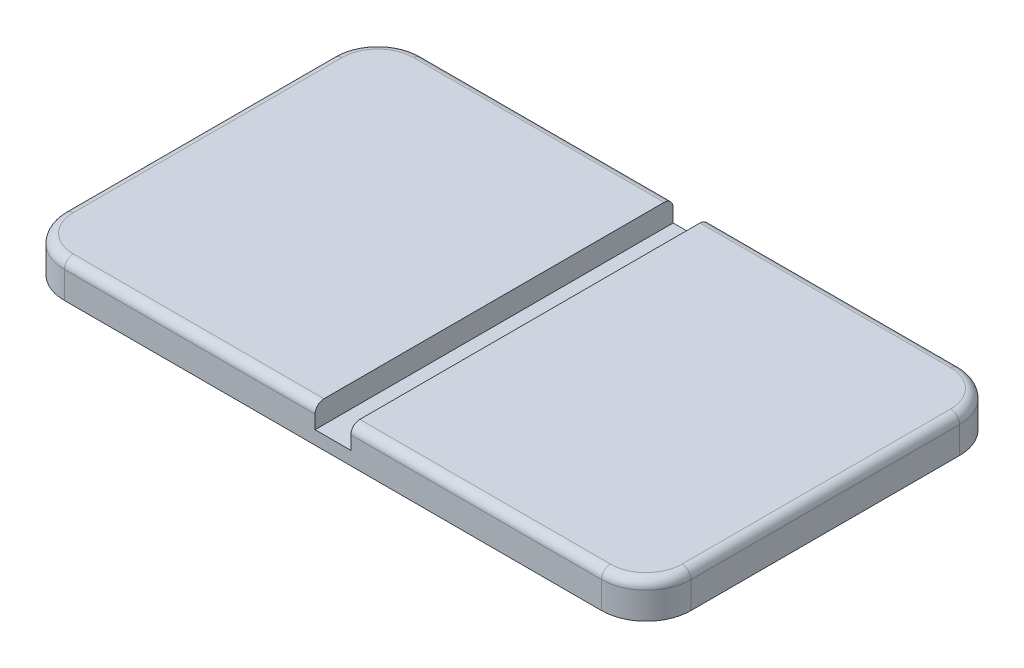
ISO-10303-21;
HEADER;
FILE_DESCRIPTION(('STEP AP214'),'2;1');
FILE_NAME('part.step','',(''),(''),'','','');
FILE_SCHEMA(('AUTOMOTIVE_DESIGN { 1 0 10303 214 1 1 1 1 }'));
ENDSEC;
DATA;
#1=APPLICATION_CONTEXT('core data for automotive mechanical design processes');
#2=APPLICATION_PROTOCOL_DEFINITION('international standard','automotive_design',2000,#1);
#3=PRODUCT_CONTEXT('',#1,'mechanical');
#4=PRODUCT('Part','Part','',(#3));
#5=PRODUCT_RELATED_PRODUCT_CATEGORY('part','',(#4));
#6=PRODUCT_DEFINITION_FORMATION('','',#4);
#7=PRODUCT_DEFINITION_CONTEXT('part definition',#1,'design');
#8=PRODUCT_DEFINITION('design','',#6,#7);
#9=PRODUCT_DEFINITION_SHAPE('','',#8);
#10=(LENGTH_UNIT() NAMED_UNIT(*) SI_UNIT(.MILLI.,.METRE.));
#11=(NAMED_UNIT(*) PLANE_ANGLE_UNIT() SI_UNIT($,.RADIAN.));
#12=(NAMED_UNIT(*) SI_UNIT($,.STERADIAN.) SOLID_ANGLE_UNIT());
#13=UNCERTAINTY_MEASURE_WITH_UNIT(LENGTH_MEASURE(1.E-05),#10,'distance_accuracy_value','');
#14=(GEOMETRIC_REPRESENTATION_CONTEXT(3) GLOBAL_UNCERTAINTY_ASSIGNED_CONTEXT((#13)) GLOBAL_UNIT_ASSIGNED_CONTEXT((#10,
#11,#12)) REPRESENTATION_CONTEXT('',''));
#15=CARTESIAN_POINT('',(0.,0.,0.));
#16=DIRECTION('',(0.,0.,1.));
#17=DIRECTION('',(1.,0.,0.));
#18=AXIS2_PLACEMENT_3D('',#15,#16,#17);
#19=CARTESIAN_POINT('',(0.,3.,-40.));
#20=DIRECTION('',(0.,0.,-1.));
#21=DIRECTION('',(-1.,0.,0.));
#22=AXIS2_PLACEMENT_3D('',#19,#20,#21);
#23=PLANE('',#22);
#24=DIRECTION('',(0.,-1.,0.));
#25=VECTOR('',#24,1.);
#26=CARTESIAN_POINT('',(3.99999999999999,8.,-40.));
#27=LINE('',#26,#25);
#28=CARTESIAN_POINT('',(3.99999999999999,6.,-40.));
#29=VERTEX_POINT('',#28);
#30=CARTESIAN_POINT('',(3.99999999999999,3.,-40.));
#31=VERTEX_POINT('',#30);
#32=EDGE_CURVE('E217',#29,#31,#27,.T.);
#33=ORIENTED_EDGE('',*,*,#32,.F.);
#34=DIRECTION('',(1.,0.,0.));
#35=VECTOR('',#34,1.);
#36=CARTESIAN_POINT('',(0.,6.,-40.));
#37=LINE('',#36,#35);
#38=CARTESIAN_POINT('',(60.,6.,-40.));
#39=VERTEX_POINT('',#38);
#40=EDGE_CURVE('E314',#29,#39,#37,.T.);
#41=ORIENTED_EDGE('',*,*,#40,.T.);
#42=DIRECTION('',(0.,-1.,0.));
#43=VECTOR('',#42,1.);
#44=CARTESIAN_POINT('',(60.,8.,-40.));
#45=LINE('',#44,#43);
#46=CARTESIAN_POINT('',(60.,0.,-40.));
#47=VERTEX_POINT('',#46);
#48=EDGE_CURVE('E220',#39,#47,#45,.T.);
#49=ORIENTED_EDGE('',*,*,#48,.T.);
#50=DIRECTION('',(1.,0.,0.));
#51=VECTOR('',#50,1.);
#52=CARTESIAN_POINT('',(0.,0.,-40.));
#53=LINE('',#52,#51);
#54=CARTESIAN_POINT('',(-60.,0.,-40.));
#55=VERTEX_POINT('',#54);
#56=EDGE_CURVE('E258',#55,#47,#53,.T.);
#57=ORIENTED_EDGE('',*,*,#56,.F.);
#58=DIRECTION('',(0.,-1.,0.));
#59=VECTOR('',#58,1.);
#60=CARTESIAN_POINT('',(-60.,8.,-40.));
#61=LINE('',#60,#59);
#62=CARTESIAN_POINT('',(-60.,6.,-40.));
#63=VERTEX_POINT('',#62);
#64=EDGE_CURVE('E255',#63,#55,#61,.T.);
#65=ORIENTED_EDGE('',*,*,#64,.F.);
#66=DIRECTION('',(1.,0.,0.));
#67=VECTOR('',#66,1.);
#68=CARTESIAN_POINT('',(0.,6.,-40.));
#69=LINE('',#68,#67);
#70=CARTESIAN_POINT('',(-4.00000000000001,6.,-40.));
#71=VERTEX_POINT('',#70);
#72=EDGE_CURVE('E311',#63,#71,#69,.T.);
#73=ORIENTED_EDGE('',*,*,#72,.T.);
#74=DIRECTION('',(0.,-1.,0.));
#75=VECTOR('',#74,1.);
#76=CARTESIAN_POINT('',(-4.00000000000001,8.,-40.));
#77=LINE('',#76,#75);
#78=CARTESIAN_POINT('',(-4.00000000000001,3.,-40.));
#79=VERTEX_POINT('',#78);
#80=EDGE_CURVE('E229',#71,#79,#77,.T.);
#81=ORIENTED_EDGE('',*,*,#80,.T.);
#82=DIRECTION('',(1.,0.,0.));
#83=VECTOR('',#82,1.);
#84=CARTESIAN_POINT('',(0.,3.,-40.));
#85=LINE('',#84,#83);
#86=EDGE_CURVE('E259',#79,#31,#85,.T.);
#87=ORIENTED_EDGE('',*,*,#86,.T.);
#88=EDGE_LOOP('',(#33,#41,#49,#57,#65,#73,#81,#87));
#89=FACE_BOUND('',#88,.T.);
#90=ADVANCED_FACE('F45',(#89),#23,.T.);
#91=CARTESIAN_POINT('',(0.,3.,40.));
#92=DIRECTION('',(0.,0.,-1.));
#93=DIRECTION('',(-1.,0.,0.));
#94=AXIS2_PLACEMENT_3D('',#91,#92,#93);
#95=PLANE('',#94);
#96=DIRECTION('',(0.,-1.,0.));
#97=VECTOR('',#96,1.);
#98=CARTESIAN_POINT('',(60.,8.,40.));
#99=LINE('',#98,#97);
#100=CARTESIAN_POINT('',(60.,6.,40.));
#101=VERTEX_POINT('',#100);
#102=CARTESIAN_POINT('',(60.,0.,40.));
#103=VERTEX_POINT('',#102);
#104=EDGE_CURVE('E198',#101,#103,#99,.T.);
#105=ORIENTED_EDGE('',*,*,#104,.F.);
#106=DIRECTION('',(1.,0.,0.));
#107=VECTOR('',#106,1.);
#108=CARTESIAN_POINT('',(3.99999999999999,6.,40.));
#109=LINE('',#108,#107);
#110=CARTESIAN_POINT('',(3.99999999999999,6.,40.));
#111=VERTEX_POINT('',#110);
#112=EDGE_CURVE('E299',#101,#111,#109,.F.);
#113=ORIENTED_EDGE('',*,*,#112,.T.);
#114=DIRECTION('',(0.,-1.,0.));
#115=VECTOR('',#114,1.);
#116=CARTESIAN_POINT('',(3.99999999999999,8.,40.));
#117=LINE('',#116,#115);
#118=CARTESIAN_POINT('',(3.99999999999999,3.,40.));
#119=VERTEX_POINT('',#118);
#120=EDGE_CURVE('E214',#111,#119,#117,.T.);
#121=ORIENTED_EDGE('',*,*,#120,.T.);
#122=DIRECTION('',(1.,0.,0.));
#123=VECTOR('',#122,1.);
#124=CARTESIAN_POINT('',(0.,3.,40.));
#125=LINE('',#124,#123);
#126=CARTESIAN_POINT('',(-4.00000000000001,3.,40.));
#127=VERTEX_POINT('',#126);
#128=EDGE_CURVE('E268',#127,#119,#125,.T.);
#129=ORIENTED_EDGE('',*,*,#128,.F.);
#130=DIRECTION('',(0.,-1.,0.));
#131=VECTOR('',#130,1.);
#132=CARTESIAN_POINT('',(-4.00000000000001,8.,40.));
#133=LINE('',#132,#131);
#134=CARTESIAN_POINT('',(-4.00000000000001,6.,40.));
#135=VERTEX_POINT('',#134);
#136=EDGE_CURVE('E243',#135,#127,#133,.T.);
#137=ORIENTED_EDGE('',*,*,#136,.F.);
#138=DIRECTION('',(1.,0.,0.));
#139=VECTOR('',#138,1.);
#140=CARTESIAN_POINT('',(-60.,6.,40.));
#141=LINE('',#140,#139);
#142=CARTESIAN_POINT('',(-60.,6.,40.));
#143=VERTEX_POINT('',#142);
#144=EDGE_CURVE('E296',#135,#143,#141,.F.);
#145=ORIENTED_EDGE('',*,*,#144,.T.);
#146=DIRECTION('',(0.,-1.,0.));
#147=VECTOR('',#146,1.);
#148=CARTESIAN_POINT('',(-60.,8.,40.));
#149=LINE('',#148,#147);
#150=CARTESIAN_POINT('',(-60.,0.,40.));
#151=VERTEX_POINT('',#150);
#152=EDGE_CURVE('E246',#143,#151,#149,.T.);
#153=ORIENTED_EDGE('',*,*,#152,.T.);
#154=DIRECTION('',(1.,0.,0.));
#155=VECTOR('',#154,1.);
#156=CARTESIAN_POINT('',(0.,0.,40.));
#157=LINE('',#156,#155);
#158=EDGE_CURVE('E264',#151,#103,#157,.T.);
#159=ORIENTED_EDGE('',*,*,#158,.T.);
#160=EDGE_LOOP('',(#105,#113,#121,#129,#137,#145,#153,#159));
#161=FACE_BOUND('',#160,.T.);
#162=ADVANCED_FACE('F431',(#161),#95,.F.);
#163=CARTESIAN_POINT('',(0.,3.,0.));
#164=DIRECTION('',(0.,1.,0.));
#165=DIRECTION('',(0.,0.,1.));
#166=AXIS2_PLACEMENT_3D('',#163,#164,#165);
#167=PLANE('',#166);
#168=ORIENTED_EDGE('',*,*,#86,.F.);
#169=DIRECTION('',(0.,0.,1.));
#170=VECTOR('',#169,1.);
#171=CARTESIAN_POINT('',(-4.00000000000001,3.,0.));
#172=LINE('',#171,#170);
#173=EDGE_CURVE('E263',#79,#127,#172,.T.);
#174=ORIENTED_EDGE('',*,*,#173,.T.);
#175=ORIENTED_EDGE('',*,*,#128,.T.);
#176=DIRECTION('',(0.,0.,1.));
#177=VECTOR('',#176,1.);
#178=CARTESIAN_POINT('',(3.99999999999999,3.,0.));
#179=LINE('',#178,#177);
#180=EDGE_CURVE('E272',#31,#119,#179,.T.);
#181=ORIENTED_EDGE('',*,*,#180,.F.);
#182=EDGE_LOOP('',(#168,#174,#175,#181));
#183=FACE_BOUND('',#182,.T.);
#184=ADVANCED_FACE('F397',(#183),#167,.T.);
#185=CARTESIAN_POINT('',(0.,0.,0.));
#186=DIRECTION('',(0.,1.,0.));
#187=DIRECTION('',(0.,0.,1.));
#188=AXIS2_PLACEMENT_3D('',#185,#186,#187);
#189=PLANE('',#188);
#190=ORIENTED_EDGE('',*,*,#56,.T.);
#191=CARTESIAN_POINT('',(60.,0.,-30.));
#192=DIRECTION('',(0.,1.,0.));
#193=DIRECTION('',(0.,0.,1.));
#194=AXIS2_PLACEMENT_3D('',#191,#192,#193);
#195=CIRCLE('',#194,10.);
#196=CARTESIAN_POINT('',(70.,0.,-30.));
#197=VERTEX_POINT('',#196);
#198=EDGE_CURVE('E193',#47,#197,#195,.F.);
#199=ORIENTED_EDGE('',*,*,#198,.T.);
#200=DIRECTION('',(0.,0.,-1.));
#201=VECTOR('',#200,1.);
#202=CARTESIAN_POINT('',(70.,0.,0.));
#203=LINE('',#202,#201);
#204=CARTESIAN_POINT('',(70.,0.,30.));
#205=VERTEX_POINT('',#204);
#206=EDGE_CURVE('E176',#205,#197,#203,.T.);
#207=ORIENTED_EDGE('',*,*,#206,.F.);
#208=CARTESIAN_POINT('',(60.,0.,30.));
#209=DIRECTION('',(0.,1.,0.));
#210=DIRECTION('',(0.,0.,1.));
#211=AXIS2_PLACEMENT_3D('',#208,#209,#210);
#212=CIRCLE('',#211,10.);
#213=EDGE_CURVE('E191',#205,#103,#212,.F.);
#214=ORIENTED_EDGE('',*,*,#213,.T.);
#215=ORIENTED_EDGE('',*,*,#158,.F.);
#216=CARTESIAN_POINT('',(-60.,0.,30.));
#217=DIRECTION('',(0.,1.,0.));
#218=DIRECTION('',(0.,0.,1.));
#219=AXIS2_PLACEMENT_3D('',#216,#217,#218);
#220=CIRCLE('',#219,10.);
#221=CARTESIAN_POINT('',(-70.,0.,30.));
#222=VERTEX_POINT('',#221);
#223=EDGE_CURVE('E230',#222,#151,#220,.T.);
#224=ORIENTED_EDGE('',*,*,#223,.F.);
#225=DIRECTION('',(0.,0.,-1.));
#226=VECTOR('',#225,1.);
#227=CARTESIAN_POINT('',(-70.,0.,0.));
#228=LINE('',#227,#226);
#229=CARTESIAN_POINT('',(-70.,0.,-30.));
#230=VERTEX_POINT('',#229);
#231=EDGE_CURVE('E234',#222,#230,#228,.T.);
#232=ORIENTED_EDGE('',*,*,#231,.T.);
#233=CARTESIAN_POINT('',(-60.,0.,-30.));
#234=DIRECTION('',(0.,1.,0.));
#235=DIRECTION('',(0.,0.,1.));
#236=AXIS2_PLACEMENT_3D('',#233,#234,#235);
#237=CIRCLE('',#236,10.);
#238=EDGE_CURVE('E183',#55,#230,#237,.T.);
#239=ORIENTED_EDGE('',*,*,#238,.F.);
#240=EDGE_LOOP('',(#190,#199,#207,#214,#215,#224,#232,#239));
#241=FACE_BOUND('',#240,.T.);
#242=ADVANCED_FACE('F189',(#241),#189,.F.);
#243=CARTESIAN_POINT('',(-4.00000000000001,8.,0.));
#244=DIRECTION('',(1.,0.,0.));
#245=DIRECTION('',(0.,0.,-1.));
#246=AXIS2_PLACEMENT_3D('',#243,#244,#245);
#247=PLANE('',#246);
#248=DIRECTION('',(0.,0.,1.));
#249=VECTOR('',#248,1.);
#250=CARTESIAN_POINT('',(-4.00000000000001,8.,0.));
#251=LINE('',#250,#249);
#252=CARTESIAN_POINT('',(-4.00000000000001,8.,-38.));
#253=VERTEX_POINT('',#252);
#254=CARTESIAN_POINT('',(-4.00000000000001,8.,38.));
#255=VERTEX_POINT('',#254);
#256=EDGE_CURVE('E225',#253,#255,#251,.T.);
#257=ORIENTED_EDGE('',*,*,#256,.T.);
#258=CARTESIAN_POINT('',(-4.00000000000001,6.,38.));
#259=DIRECTION('',(1.,0.,0.));
#260=DIRECTION('',(0.,0.,-1.));
#261=AXIS2_PLACEMENT_3D('',#258,#259,#260);
#262=CIRCLE('',#261,2.);
#263=EDGE_CURVE('E339',#255,#135,#262,.T.);
#264=ORIENTED_EDGE('',*,*,#263,.T.);
#265=ORIENTED_EDGE('',*,*,#136,.T.);
#266=ORIENTED_EDGE('',*,*,#173,.F.);
#267=ORIENTED_EDGE('',*,*,#80,.F.);
#268=CARTESIAN_POINT('',(-4.00000000000001,6.,-38.));
#269=DIRECTION('',(1.,0.,0.));
#270=DIRECTION('',(0.,0.,-1.));
#271=AXIS2_PLACEMENT_3D('',#268,#269,#270);
#272=CIRCLE('',#271,2.);
#273=EDGE_CURVE('E336',#71,#253,#272,.T.);
#274=ORIENTED_EDGE('',*,*,#273,.T.);
#275=EDGE_LOOP('',(#257,#264,#265,#266,#267,#274));
#276=FACE_BOUND('',#275,.T.);
#277=ADVANCED_FACE('F390',(#276),#247,.T.);
#278=CARTESIAN_POINT('',(-60.,8.,-30.));
#279=DIRECTION('',(0.,-1.,0.));
#280=DIRECTION('',(0.,0.,-1.));
#281=AXIS2_PLACEMENT_3D('',#278,#279,#280);
#282=CYLINDRICAL_SURFACE('',#281,10.);
#283=DIRECTION('',(0.,-1.,0.));
#284=VECTOR('',#283,1.);
#285=CARTESIAN_POINT('',(-70.,8.,-30.));
#286=LINE('',#285,#284);
#287=CARTESIAN_POINT('',(-70.,6.,-30.));
#288=VERTEX_POINT('',#287);
#289=EDGE_CURVE('E252',#288,#230,#286,.T.);
#290=ORIENTED_EDGE('',*,*,#289,.F.);
#291=CARTESIAN_POINT('',(-60.,6.,-30.));
#292=DIRECTION('',(0.,1.,0.));
#293=DIRECTION('',(0.,0.,1.));
#294=AXIS2_PLACEMENT_3D('',#291,#292,#293);
#295=CIRCLE('',#294,10.);
#296=EDGE_CURVE('E344',#288,#63,#295,.F.);
#297=ORIENTED_EDGE('',*,*,#296,.T.);
#298=ORIENTED_EDGE('',*,*,#64,.T.);
#299=ORIENTED_EDGE('',*,*,#238,.T.);
#300=EDGE_LOOP('',(#290,#297,#298,#299));
#301=FACE_BOUND('',#300,.T.);
#302=ADVANCED_FACE('F417',(#301),#282,.T.);
#303=CARTESIAN_POINT('',(-70.,8.,0.));
#304=DIRECTION('',(-1.,0.,0.));
#305=DIRECTION('',(0.,0.,1.));
#306=AXIS2_PLACEMENT_3D('',#303,#304,#305);
#307=PLANE('',#306);
#308=DIRECTION('',(0.,-1.,0.));
#309=VECTOR('',#308,1.);
#310=CARTESIAN_POINT('',(-70.,8.,30.));
#311=LINE('',#310,#309);
#312=CARTESIAN_POINT('',(-70.,6.,30.));
#313=VERTEX_POINT('',#312);
#314=EDGE_CURVE('E249',#313,#222,#311,.T.);
#315=ORIENTED_EDGE('',*,*,#314,.F.);
#316=DIRECTION('',(0.,0.,-1.));
#317=VECTOR('',#316,1.);
#318=CARTESIAN_POINT('',(-70.,6.,0.));
#319=LINE('',#318,#317);
#320=EDGE_CURVE('E11',#313,#288,#319,.T.);
#321=ORIENTED_EDGE('',*,*,#320,.T.);
#322=ORIENTED_EDGE('',*,*,#289,.T.);
#323=ORIENTED_EDGE('',*,*,#231,.F.);
#324=EDGE_LOOP('',(#315,#321,#322,#323));
#325=FACE_BOUND('',#324,.T.);
#326=ADVANCED_FACE('F418',(#325),#307,.T.);
#327=CARTESIAN_POINT('',(-60.,8.,30.));
#328=DIRECTION('',(0.,-1.,0.));
#329=DIRECTION('',(0.,0.,-1.));
#330=AXIS2_PLACEMENT_3D('',#327,#328,#329);
#331=CYLINDRICAL_SURFACE('',#330,10.);
#332=ORIENTED_EDGE('',*,*,#152,.F.);
#333=CARTESIAN_POINT('',(-60.,6.,30.));
#334=DIRECTION('',(0.,1.,0.));
#335=DIRECTION('',(0.,0.,1.));
#336=AXIS2_PLACEMENT_3D('',#333,#334,#335);
#337=CIRCLE('',#336,10.);
#338=EDGE_CURVE('E69',#143,#313,#337,.F.);
#339=ORIENTED_EDGE('',*,*,#338,.T.);
#340=ORIENTED_EDGE('',*,*,#314,.T.);
#341=ORIENTED_EDGE('',*,*,#223,.T.);
#342=EDGE_LOOP('',(#332,#339,#340,#341));
#343=FACE_BOUND('',#342,.T.);
#344=ADVANCED_FACE('F484',(#343),#331,.T.);
#345=CARTESIAN_POINT('',(0.,8.,0.));
#346=DIRECTION('',(0.,1.,0.));
#347=DIRECTION('',(0.,0.,1.));
#348=AXIS2_PLACEMENT_3D('',#345,#346,#347);
#349=PLANE('',#348);
#350=CARTESIAN_POINT('',(-60.,8.,30.));
#351=DIRECTION('',(0.,1.,0.));
#352=DIRECTION('',(0.,0.,1.));
#353=AXIS2_PLACEMENT_3D('',#350,#351,#352);
#354=CIRCLE('',#353,8.00000000000001);
#355=CARTESIAN_POINT('',(-68.,8.,30.));
#356=VERTEX_POINT('',#355);
#357=CARTESIAN_POINT('',(-60.,8.,38.));
#358=VERTEX_POINT('',#357);
#359=EDGE_CURVE('E329',#356,#358,#354,.T.);
#360=ORIENTED_EDGE('',*,*,#359,.T.);
#361=DIRECTION('',(1.,0.,0.));
#362=VECTOR('',#361,1.);
#363=CARTESIAN_POINT('',(-4.00000000000001,8.,38.));
#364=LINE('',#363,#362);
#365=EDGE_CURVE('E332',#358,#255,#364,.T.);
#366=ORIENTED_EDGE('',*,*,#365,.T.);
#367=ORIENTED_EDGE('',*,*,#256,.F.);
#368=DIRECTION('',(1.,0.,0.));
#369=VECTOR('',#368,1.);
#370=CARTESIAN_POINT('',(0.,8.,-38.));
#371=LINE('',#370,#369);
#372=CARTESIAN_POINT('',(-60.,8.,-38.));
#373=VERTEX_POINT('',#372);
#374=EDGE_CURVE('E326',#253,#373,#371,.F.);
#375=ORIENTED_EDGE('',*,*,#374,.T.);
#376=CARTESIAN_POINT('',(-60.,8.,-30.));
#377=DIRECTION('',(0.,1.,0.));
#378=DIRECTION('',(0.,0.,1.));
#379=AXIS2_PLACEMENT_3D('',#376,#377,#378);
#380=CIRCLE('',#379,8.00000000000001);
#381=CARTESIAN_POINT('',(-68.,8.,-30.));
#382=VERTEX_POINT('',#381);
#383=EDGE_CURVE('E323',#373,#382,#380,.T.);
#384=ORIENTED_EDGE('',*,*,#383,.T.);
#385=DIRECTION('',(0.,0.,-1.));
#386=VECTOR('',#385,1.);
#387=CARTESIAN_POINT('',(-68.,8.,0.));
#388=LINE('',#387,#386);
#389=EDGE_CURVE('E320',#382,#356,#388,.F.);
#390=ORIENTED_EDGE('',*,*,#389,.T.);
#391=EDGE_LOOP('',(#360,#366,#367,#375,#384,#390));
#392=FACE_BOUND('',#391,.T.);
#393=ADVANCED_FACE('F427',(#392),#349,.T.);
#394=CARTESIAN_POINT('',(3.99999999999999,8.,0.));
#395=DIRECTION('',(1.,0.,0.));
#396=DIRECTION('',(0.,0.,-1.));
#397=AXIS2_PLACEMENT_3D('',#394,#395,#396);
#398=PLANE('',#397);
#399=ORIENTED_EDGE('',*,*,#120,.F.);
#400=CARTESIAN_POINT('',(3.99999999999999,6.,38.));
#401=DIRECTION('',(1.,0.,0.));
#402=DIRECTION('',(0.,0.,-1.));
#403=AXIS2_PLACEMENT_3D('',#400,#401,#402);
#404=CIRCLE('',#403,2.);
#405=CARTESIAN_POINT('',(3.99999999999999,8.,38.));
#406=VERTEX_POINT('',#405);
#407=EDGE_CURVE('E305',#111,#406,#404,.F.);
#408=ORIENTED_EDGE('',*,*,#407,.T.);
#409=DIRECTION('',(0.,0.,1.));
#410=VECTOR('',#409,1.);
#411=CARTESIAN_POINT('',(3.99999999999999,8.,0.));
#412=LINE('',#411,#410);
#413=CARTESIAN_POINT('',(3.99999999999999,8.,-38.));
#414=VERTEX_POINT('',#413);
#415=EDGE_CURVE('E208',#414,#406,#412,.T.);
#416=ORIENTED_EDGE('',*,*,#415,.F.);
#417=CARTESIAN_POINT('',(3.99999999999999,6.,-38.));
#418=DIRECTION('',(1.,0.,0.));
#419=DIRECTION('',(0.,0.,-1.));
#420=AXIS2_PLACEMENT_3D('',#417,#418,#419);
#421=CIRCLE('',#420,2.);
#422=EDGE_CURVE('E302',#414,#29,#421,.F.);
#423=ORIENTED_EDGE('',*,*,#422,.T.);
#424=ORIENTED_EDGE('',*,*,#32,.T.);
#425=ORIENTED_EDGE('',*,*,#180,.T.);
#426=EDGE_LOOP('',(#399,#408,#416,#423,#424,#425));
#427=FACE_BOUND('',#426,.T.);
#428=ADVANCED_FACE('F475',(#427),#398,.F.);
#429=CARTESIAN_POINT('',(60.,8.,30.));
#430=DIRECTION('',(0.,-1.,0.));
#431=DIRECTION('',(0.,0.,-1.));
#432=AXIS2_PLACEMENT_3D('',#429,#430,#431);
#433=CYLINDRICAL_SURFACE('',#432,10.);
#434=DIRECTION('',(0.,-1.,0.));
#435=VECTOR('',#434,1.);
#436=CARTESIAN_POINT('',(70.,8.,30.));
#437=LINE('',#436,#435);
#438=CARTESIAN_POINT('',(70.,6.,30.));
#439=VERTEX_POINT('',#438);
#440=EDGE_CURVE('E172',#439,#205,#437,.T.);
#441=ORIENTED_EDGE('',*,*,#440,.F.);
#442=CARTESIAN_POINT('',(60.,6.,30.));
#443=DIRECTION('',(0.,1.,0.));
#444=DIRECTION('',(0.,0.,1.));
#445=AXIS2_PLACEMENT_3D('',#442,#443,#444);
#446=CIRCLE('',#445,10.);
#447=EDGE_CURVE('E308',#439,#101,#446,.F.);
#448=ORIENTED_EDGE('',*,*,#447,.T.);
#449=ORIENTED_EDGE('',*,*,#104,.T.);
#450=ORIENTED_EDGE('',*,*,#213,.F.);
#451=EDGE_LOOP('',(#441,#448,#449,#450));
#452=FACE_BOUND('',#451,.T.);
#453=ADVANCED_FACE('F196',(#452),#433,.T.);
#454=CARTESIAN_POINT('',(70.,8.,0.));
#455=DIRECTION('',(-1.,0.,0.));
#456=DIRECTION('',(0.,0.,1.));
#457=AXIS2_PLACEMENT_3D('',#454,#455,#456);
#458=PLANE('',#457);
#459=DIRECTION('',(0.,-1.,0.));
#460=VECTOR('',#459,1.);
#461=CARTESIAN_POINT('',(70.,8.,-30.));
#462=LINE('',#461,#460);
#463=CARTESIAN_POINT('',(70.,6.,-30.));
#464=VERTEX_POINT('',#463);
#465=EDGE_CURVE('E184',#464,#197,#462,.T.);
#466=ORIENTED_EDGE('',*,*,#465,.F.);
#467=DIRECTION('',(0.,0.,-1.));
#468=VECTOR('',#467,1.);
#469=CARTESIAN_POINT('',(70.,6.,30.));
#470=LINE('',#469,#468);
#471=EDGE_CURVE('E55',#464,#439,#470,.F.);
#472=ORIENTED_EDGE('',*,*,#471,.T.);
#473=ORIENTED_EDGE('',*,*,#440,.T.);
#474=ORIENTED_EDGE('',*,*,#206,.T.);
#475=EDGE_LOOP('',(#466,#472,#473,#474));
#476=FACE_BOUND('',#475,.T.);
#477=ADVANCED_FACE('F175',(#476),#458,.F.);
#478=CARTESIAN_POINT('',(60.,8.,-30.));
#479=DIRECTION('',(0.,-1.,0.));
#480=DIRECTION('',(0.,0.,-1.));
#481=AXIS2_PLACEMENT_3D('',#478,#479,#480);
#482=CYLINDRICAL_SURFACE('',#481,10.);
#483=ORIENTED_EDGE('',*,*,#48,.F.);
#484=CARTESIAN_POINT('',(60.,6.,-30.));
#485=DIRECTION('',(0.,1.,0.));
#486=DIRECTION('',(0.,0.,1.));
#487=AXIS2_PLACEMENT_3D('',#484,#485,#486);
#488=CIRCLE('',#487,10.);
#489=EDGE_CURVE('E317',#39,#464,#488,.F.);
#490=ORIENTED_EDGE('',*,*,#489,.T.);
#491=ORIENTED_EDGE('',*,*,#465,.T.);
#492=ORIENTED_EDGE('',*,*,#198,.F.);
#493=EDGE_LOOP('',(#483,#490,#491,#492));
#494=FACE_BOUND('',#493,.T.);
#495=ADVANCED_FACE('F412',(#494),#482,.T.);
#496=CARTESIAN_POINT('',(0.,8.,0.));
#497=DIRECTION('',(0.,1.,0.));
#498=DIRECTION('',(0.,0.,1.));
#499=AXIS2_PLACEMENT_3D('',#496,#497,#498);
#500=PLANE('',#499);
#501=ORIENTED_EDGE('',*,*,#415,.T.);
#502=DIRECTION('',(1.,0.,0.));
#503=VECTOR('',#502,1.);
#504=CARTESIAN_POINT('',(60.,8.,38.));
#505=LINE('',#504,#503);
#506=CARTESIAN_POINT('',(60.,8.,38.));
#507=VERTEX_POINT('',#506);
#508=EDGE_CURVE('E292',#406,#507,#505,.T.);
#509=ORIENTED_EDGE('',*,*,#508,.T.);
#510=CARTESIAN_POINT('',(60.,8.,30.));
#511=DIRECTION('',(0.,1.,0.));
#512=DIRECTION('',(0.,0.,1.));
#513=AXIS2_PLACEMENT_3D('',#510,#511,#512);
#514=CIRCLE('',#513,8.);
#515=CARTESIAN_POINT('',(68.,8.,30.));
#516=VERTEX_POINT('',#515);
#517=EDGE_CURVE('E289',#507,#516,#514,.T.);
#518=ORIENTED_EDGE('',*,*,#517,.T.);
#519=DIRECTION('',(0.,0.,-1.));
#520=VECTOR('',#519,1.);
#521=CARTESIAN_POINT('',(68.,8.,-30.));
#522=LINE('',#521,#520);
#523=CARTESIAN_POINT('',(68.,8.,-30.));
#524=VERTEX_POINT('',#523);
#525=EDGE_CURVE('E276',#516,#524,#522,.T.);
#526=ORIENTED_EDGE('',*,*,#525,.T.);
#527=CARTESIAN_POINT('',(60.,8.,-30.));
#528=DIRECTION('',(0.,1.,0.));
#529=DIRECTION('',(0.,0.,1.));
#530=AXIS2_PLACEMENT_3D('',#527,#528,#529);
#531=CIRCLE('',#530,8.);
#532=CARTESIAN_POINT('',(60.,8.,-38.));
#533=VERTEX_POINT('',#532);
#534=EDGE_CURVE('E283',#524,#533,#531,.T.);
#535=ORIENTED_EDGE('',*,*,#534,.T.);
#536=DIRECTION('',(1.,0.,0.));
#537=VECTOR('',#536,1.);
#538=CARTESIAN_POINT('',(0.,8.,-38.));
#539=LINE('',#538,#537);
#540=EDGE_CURVE('E286',#533,#414,#539,.F.);
#541=ORIENTED_EDGE('',*,*,#540,.T.);
#542=EDGE_LOOP('',(#501,#509,#518,#526,#535,#541));
#543=FACE_BOUND('',#542,.T.);
#544=ADVANCED_FACE('F463',(#543),#500,.T.);
#545=CARTESIAN_POINT('',(0.,6.,-38.));
#546=DIRECTION('',(1.,0.,0.));
#547=DIRECTION('',(0.,0.,-1.));
#548=AXIS2_PLACEMENT_3D('',#545,#546,#547);
#549=CYLINDRICAL_SURFACE('',#548,2.);
#550=ORIENTED_EDGE('',*,*,#422,.F.);
#551=ORIENTED_EDGE('',*,*,#540,.F.);
#552=CARTESIAN_POINT('',(60.,6.,-38.));
#553=DIRECTION('',(1.,0.,0.));
#554=DIRECTION('',(0.,0.,-1.));
#555=AXIS2_PLACEMENT_3D('',#552,#553,#554);
#556=CIRCLE('',#555,2.);
#557=EDGE_CURVE('E201',#39,#533,#556,.T.);
#558=ORIENTED_EDGE('',*,*,#557,.F.);
#559=ORIENTED_EDGE('',*,*,#40,.F.);
#560=EDGE_LOOP('',(#550,#551,#558,#559));
#561=FACE_BOUND('',#560,.T.);
#562=ADVANCED_FACE('F404',(#561),#549,.T.);
#563=CARTESIAN_POINT('',(60.,6.,-30.));
#564=DIRECTION('',(0.,1.,0.));
#565=DIRECTION('',(0.,0.,1.));
#566=AXIS2_PLACEMENT_3D('',#563,#564,#565);
#567=TOROIDAL_SURFACE('',#566,8.,2.);
#568=ORIENTED_EDGE('',*,*,#557,.T.);
#569=ORIENTED_EDGE('',*,*,#534,.F.);
#570=CARTESIAN_POINT('',(68.,6.,-30.));
#571=DIRECTION('',(0.,0.,1.));
#572=DIRECTION('',(1.,0.,0.));
#573=AXIS2_PLACEMENT_3D('',#570,#571,#572);
#574=CIRCLE('',#573,2.);
#575=EDGE_CURVE('E205',#464,#524,#574,.T.);
#576=ORIENTED_EDGE('',*,*,#575,.F.);
#577=ORIENTED_EDGE('',*,*,#489,.F.);
#578=EDGE_LOOP('',(#568,#569,#576,#577));
#579=FACE_BOUND('',#578,.T.);
#580=ADVANCED_FACE('F410',(#579),#567,.T.);
#581=CARTESIAN_POINT('',(68.,6.,0.));
#582=DIRECTION('',(0.,0.,1.));
#583=DIRECTION('',(1.,0.,0.));
#584=AXIS2_PLACEMENT_3D('',#581,#582,#583);
#585=CYLINDRICAL_SURFACE('',#584,2.);
#586=ORIENTED_EDGE('',*,*,#575,.T.);
#587=ORIENTED_EDGE('',*,*,#525,.F.);
#588=CARTESIAN_POINT('',(68.,6.,30.));
#589=DIRECTION('',(0.,0.,1.));
#590=DIRECTION('',(1.,0.,0.));
#591=AXIS2_PLACEMENT_3D('',#588,#589,#590);
#592=CIRCLE('',#591,2.);
#593=EDGE_CURVE('E352',#439,#516,#592,.T.);
#594=ORIENTED_EDGE('',*,*,#593,.F.);
#595=ORIENTED_EDGE('',*,*,#471,.F.);
#596=EDGE_LOOP('',(#586,#587,#594,#595));
#597=FACE_BOUND('',#596,.T.);
#598=ADVANCED_FACE('F456',(#597),#585,.T.);
#599=CARTESIAN_POINT('',(60.,6.,30.));
#600=DIRECTION('',(0.,1.,0.));
#601=DIRECTION('',(0.,0.,1.));
#602=AXIS2_PLACEMENT_3D('',#599,#600,#601);
#603=TOROIDAL_SURFACE('',#602,8.,2.);
#604=ORIENTED_EDGE('',*,*,#593,.T.);
#605=ORIENTED_EDGE('',*,*,#517,.F.);
#606=CARTESIAN_POINT('',(60.,6.,38.));
#607=DIRECTION('',(-1.,0.,0.));
#608=DIRECTION('',(0.,0.,1.));
#609=AXIS2_PLACEMENT_3D('',#606,#607,#608);
#610=CIRCLE('',#609,2.);
#611=EDGE_CURVE('E349',#101,#507,#610,.T.);
#612=ORIENTED_EDGE('',*,*,#611,.F.);
#613=ORIENTED_EDGE('',*,*,#447,.F.);
#614=EDGE_LOOP('',(#604,#605,#612,#613));
#615=FACE_BOUND('',#614,.T.);
#616=ADVANCED_FACE('F452',(#615),#603,.T.);
#617=CARTESIAN_POINT('',(0.,6.,38.));
#618=DIRECTION('',(-1.,0.,0.));
#619=DIRECTION('',(0.,0.,1.));
#620=AXIS2_PLACEMENT_3D('',#617,#618,#619);
#621=CYLINDRICAL_SURFACE('',#620,2.);
#622=ORIENTED_EDGE('',*,*,#407,.F.);
#623=ORIENTED_EDGE('',*,*,#112,.F.);
#624=ORIENTED_EDGE('',*,*,#611,.T.);
#625=ORIENTED_EDGE('',*,*,#508,.F.);
#626=EDGE_LOOP('',(#622,#623,#624,#625));
#627=FACE_BOUND('',#626,.T.);
#628=ADVANCED_FACE('F449',(#627),#621,.T.);
#629=CARTESIAN_POINT('',(0.,6.,-38.));
#630=DIRECTION('',(1.,0.,0.));
#631=DIRECTION('',(0.,0.,-1.));
#632=AXIS2_PLACEMENT_3D('',#629,#630,#631);
#633=CYLINDRICAL_SURFACE('',#632,2.);
#634=ORIENTED_EDGE('',*,*,#273,.F.);
#635=ORIENTED_EDGE('',*,*,#72,.F.);
#636=CARTESIAN_POINT('',(-60.,6.,-38.));
#637=DIRECTION('',(-1.,0.,0.));
#638=DIRECTION('',(0.,0.,1.));
#639=AXIS2_PLACEMENT_3D('',#636,#637,#638);
#640=CIRCLE('',#639,2.);
#641=EDGE_CURVE('E49',#373,#63,#640,.T.);
#642=ORIENTED_EDGE('',*,*,#641,.F.);
#643=ORIENTED_EDGE('',*,*,#374,.F.);
#644=EDGE_LOOP('',(#634,#635,#642,#643));
#645=FACE_BOUND('',#644,.T.);
#646=ADVANCED_FACE('F47',(#645),#633,.T.);
#647=CARTESIAN_POINT('',(-60.,6.,-30.));
#648=DIRECTION('',(0.,1.,0.));
#649=DIRECTION('',(0.,0.,1.));
#650=AXIS2_PLACEMENT_3D('',#647,#648,#649);
#651=TOROIDAL_SURFACE('',#650,8.00000000000001,2.);
#652=ORIENTED_EDGE('',*,*,#641,.T.);
#653=ORIENTED_EDGE('',*,*,#296,.F.);
#654=CARTESIAN_POINT('',(-68.,6.,-30.));
#655=DIRECTION('',(0.,0.,1.));
#656=DIRECTION('',(1.,0.,0.));
#657=AXIS2_PLACEMENT_3D('',#654,#655,#656);
#658=CIRCLE('',#657,2.);
#659=EDGE_CURVE('E366',#382,#288,#658,.T.);
#660=ORIENTED_EDGE('',*,*,#659,.F.);
#661=ORIENTED_EDGE('',*,*,#383,.F.);
#662=EDGE_LOOP('',(#652,#653,#660,#661));
#663=FACE_BOUND('',#662,.T.);
#664=ADVANCED_FACE('F378',(#663),#651,.T.);
#665=CARTESIAN_POINT('',(-68.,6.,0.));
#666=DIRECTION('',(0.,0.,-1.));
#667=DIRECTION('',(-1.,0.,0.));
#668=AXIS2_PLACEMENT_3D('',#665,#666,#667);
#669=CYLINDRICAL_SURFACE('',#668,2.);
#670=ORIENTED_EDGE('',*,*,#659,.T.);
#671=ORIENTED_EDGE('',*,*,#320,.F.);
#672=CARTESIAN_POINT('',(-68.,6.,30.));
#673=DIRECTION('',(0.,0.,1.));
#674=DIRECTION('',(1.,0.,0.));
#675=AXIS2_PLACEMENT_3D('',#672,#673,#674);
#676=CIRCLE('',#675,2.);
#677=EDGE_CURVE('E363',#356,#313,#676,.T.);
#678=ORIENTED_EDGE('',*,*,#677,.F.);
#679=ORIENTED_EDGE('',*,*,#389,.F.);
#680=EDGE_LOOP('',(#670,#671,#678,#679));
#681=FACE_BOUND('',#680,.T.);
#682=ADVANCED_FACE('F420',(#681),#669,.T.);
#683=CARTESIAN_POINT('',(-60.,6.,30.));
#684=DIRECTION('',(0.,1.,0.));
#685=DIRECTION('',(0.,0.,1.));
#686=AXIS2_PLACEMENT_3D('',#683,#684,#685);
#687=TOROIDAL_SURFACE('',#686,8.00000000000001,2.);
#688=ORIENTED_EDGE('',*,*,#677,.T.);
#689=ORIENTED_EDGE('',*,*,#338,.F.);
#690=CARTESIAN_POINT('',(-60.,6.,38.));
#691=DIRECTION('',(1.,0.,0.));
#692=DIRECTION('',(0.,0.,-1.));
#693=AXIS2_PLACEMENT_3D('',#690,#691,#692);
#694=CIRCLE('',#693,2.);
#695=EDGE_CURVE('E359',#358,#143,#694,.T.);
#696=ORIENTED_EDGE('',*,*,#695,.F.);
#697=ORIENTED_EDGE('',*,*,#359,.F.);
#698=EDGE_LOOP('',(#688,#689,#696,#697));
#699=FACE_BOUND('',#698,.T.);
#700=ADVANCED_FACE('F423',(#699),#687,.T.);
#701=CARTESIAN_POINT('',(0.,6.,38.));
#702=DIRECTION('',(-1.,0.,0.));
#703=DIRECTION('',(0.,0.,1.));
#704=AXIS2_PLACEMENT_3D('',#701,#702,#703);
#705=CYLINDRICAL_SURFACE('',#704,2.);
#706=ORIENTED_EDGE('',*,*,#695,.T.);
#707=ORIENTED_EDGE('',*,*,#144,.F.);
#708=ORIENTED_EDGE('',*,*,#263,.F.);
#709=ORIENTED_EDGE('',*,*,#365,.F.);
#710=EDGE_LOOP('',(#706,#707,#708,#709));
#711=FACE_BOUND('',#710,.T.);
#712=ADVANCED_FACE('F432',(#711),#705,.T.);
#713=CLOSED_SHELL('',(#90,#162,#184,#242,#277,#302,#326,#344,#393,#428,#453,#477,#495,#544,#562,
#580,#598,#616,#628,#646,#664,#682,#700,#712));
#714=MANIFOLD_SOLID_BREP('B2',#713);
#715=ADVANCED_BREP_SHAPE_REPRESENTATION('',(#18,#714),#14);
#716=SHAPE_DEFINITION_REPRESENTATION(#9,#715);
ENDSEC;
END-ISO-10303-21;
